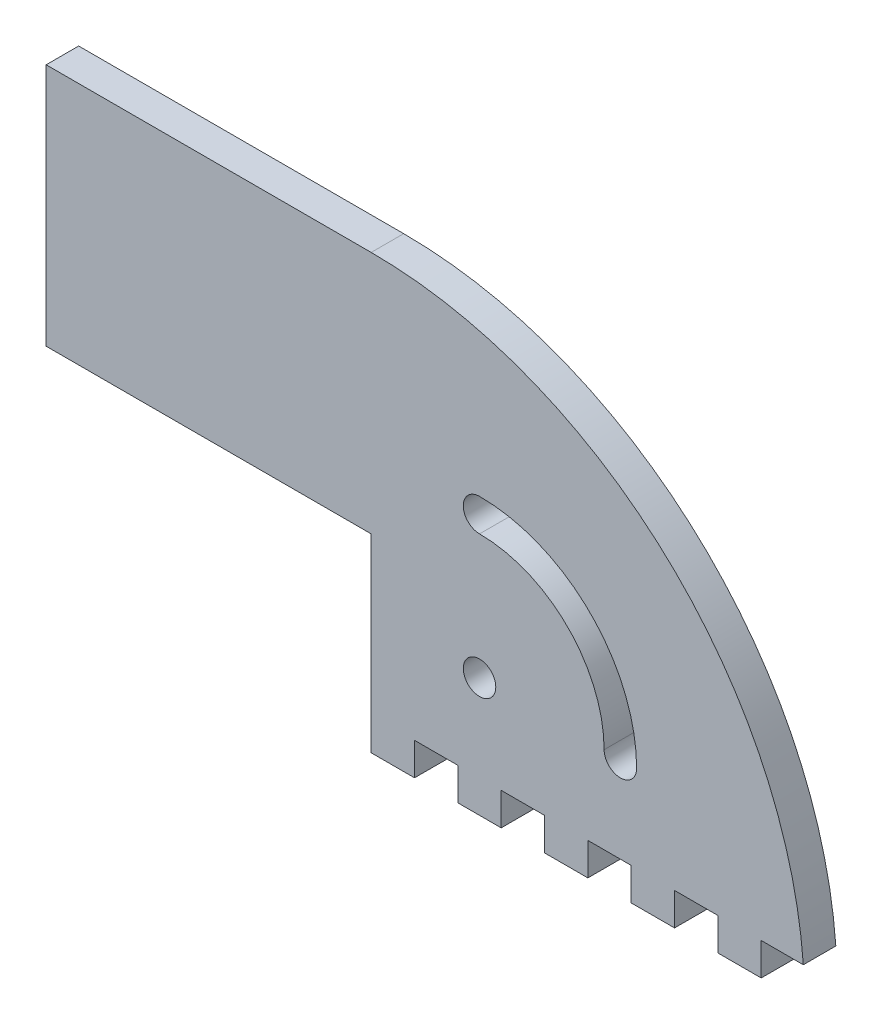
ISO-10303-21;
HEADER;
FILE_DESCRIPTION(('STEP AP214'),'2;1');
FILE_NAME('part.step','',(''),(''),'','','');
FILE_SCHEMA(('AUTOMOTIVE_DESIGN { 1 0 10303 214 1 1 1 1 }'));
ENDSEC;
DATA;
#1=APPLICATION_CONTEXT('core data for automotive mechanical design processes');
#2=APPLICATION_PROTOCOL_DEFINITION('international standard','automotive_design',2000,#1);
#3=PRODUCT_CONTEXT('',#1,'mechanical');
#4=PRODUCT('Part','Part','',(#3));
#5=PRODUCT_RELATED_PRODUCT_CATEGORY('part','',(#4));
#6=PRODUCT_DEFINITION_FORMATION('','',#4);
#7=PRODUCT_DEFINITION_CONTEXT('part definition',#1,'design');
#8=PRODUCT_DEFINITION('design','',#6,#7);
#9=PRODUCT_DEFINITION_SHAPE('','',#8);
#10=(LENGTH_UNIT() NAMED_UNIT(*) SI_UNIT(.MILLI.,.METRE.));
#11=(NAMED_UNIT(*) PLANE_ANGLE_UNIT() SI_UNIT($,.RADIAN.));
#12=(NAMED_UNIT(*) SI_UNIT($,.STERADIAN.) SOLID_ANGLE_UNIT());
#13=UNCERTAINTY_MEASURE_WITH_UNIT(LENGTH_MEASURE(1.E-05),#10,'distance_accuracy_value','');
#14=(GEOMETRIC_REPRESENTATION_CONTEXT(3) GLOBAL_UNCERTAINTY_ASSIGNED_CONTEXT((#13)) GLOBAL_UNIT_ASSIGNED_CONTEXT((#10,
#11,#12)) REPRESENTATION_CONTEXT('',''));
#15=CARTESIAN_POINT('',(0.,0.,0.));
#16=DIRECTION('',(0.,0.,1.));
#17=DIRECTION('',(1.,0.,0.));
#18=AXIS2_PLACEMENT_3D('',#15,#16,#17);
#19=CARTESIAN_POINT('',(0.,0.,3.));
#20=DIRECTION('',(0.,1.,0.));
#21=DIRECTION('',(0.,0.,1.));
#22=AXIS2_PLACEMENT_3D('',#19,#20,#21);
#23=PLANE('',#22);
#24=DIRECTION('',(1.,0.,0.));
#25=VECTOR('',#24,1.);
#26=CARTESIAN_POINT('',(0.,0.,0.));
#27=LINE('',#26,#25);
#28=CARTESIAN_POINT('',(24.,0.,0.));
#29=VERTEX_POINT('',#28);
#30=CARTESIAN_POINT('',(28.,0.,0.));
#31=VERTEX_POINT('',#30);
#32=EDGE_CURVE('E239',#29,#31,#27,.T.);
#33=ORIENTED_EDGE('',*,*,#32,.T.);
#34=DIRECTION('',(0.,0.,1.));
#35=VECTOR('',#34,1.);
#36=CARTESIAN_POINT('',(28.,0.,0.));
#37=LINE('',#36,#35);
#38=CARTESIAN_POINT('',(28.,0.,3.));
#39=VERTEX_POINT('',#38);
#40=EDGE_CURVE('E291',#31,#39,#37,.T.);
#41=ORIENTED_EDGE('',*,*,#40,.T.);
#42=DIRECTION('',(1.,0.,0.));
#43=VECTOR('',#42,1.);
#44=CARTESIAN_POINT('',(0.,0.,3.));
#45=LINE('',#44,#43);
#46=CARTESIAN_POINT('',(24.,0.,3.));
#47=VERTEX_POINT('',#46);
#48=EDGE_CURVE('E483',#47,#39,#45,.T.);
#49=ORIENTED_EDGE('',*,*,#48,.F.);
#50=DIRECTION('',(0.,0.,1.));
#51=VECTOR('',#50,1.);
#52=CARTESIAN_POINT('',(24.,0.,0.));
#53=LINE('',#52,#51);
#54=EDGE_CURVE('E305',#29,#47,#53,.T.);
#55=ORIENTED_EDGE('',*,*,#54,.F.);
#56=EDGE_LOOP('',(#33,#41,#49,#55));
#57=FACE_BOUND('',#56,.T.);
#58=ADVANCED_FACE('F33',(#57),#23,.F.);
#59=CARTESIAN_POINT('',(16.,0.,0.));
#60=VERTEX_POINT('',#59);
#61=CARTESIAN_POINT('',(20.,0.,0.));
#62=VERTEX_POINT('',#61);
#63=EDGE_CURVE('E244',#60,#62,#27,.T.);
#64=ORIENTED_EDGE('',*,*,#63,.T.);
#65=DIRECTION('',(0.,0.,1.));
#66=VECTOR('',#65,1.);
#67=CARTESIAN_POINT('',(20.,0.,0.));
#68=LINE('',#67,#66);
#69=CARTESIAN_POINT('',(20.,0.,3.));
#70=VERTEX_POINT('',#69);
#71=EDGE_CURVE('E269',#62,#70,#68,.T.);
#72=ORIENTED_EDGE('',*,*,#71,.T.);
#73=CARTESIAN_POINT('',(16.,0.,3.));
#74=VERTEX_POINT('',#73);
#75=EDGE_CURVE('E491',#74,#70,#45,.T.);
#76=ORIENTED_EDGE('',*,*,#75,.F.);
#77=DIRECTION('',(0.,0.,1.));
#78=VECTOR('',#77,1.);
#79=CARTESIAN_POINT('',(16.,0.,0.));
#80=LINE('',#79,#78);
#81=EDGE_CURVE('E271',#60,#74,#80,.T.);
#82=ORIENTED_EDGE('',*,*,#81,.F.);
#83=EDGE_LOOP('',(#64,#72,#76,#82));
#84=FACE_BOUND('',#83,.T.);
#85=ADVANCED_FACE('F267',(#84),#23,.F.);
#86=CARTESIAN_POINT('',(8.,0.,0.));
#87=VERTEX_POINT('',#86);
#88=CARTESIAN_POINT('',(12.,0.,0.));
#89=VERTEX_POINT('',#88);
#90=EDGE_CURVE('E250',#87,#89,#27,.T.);
#91=ORIENTED_EDGE('',*,*,#90,.T.);
#92=DIRECTION('',(0.,0.,1.));
#93=VECTOR('',#92,1.);
#94=CARTESIAN_POINT('',(12.,0.,0.));
#95=LINE('',#94,#93);
#96=CARTESIAN_POINT('',(12.,0.,3.));
#97=VERTEX_POINT('',#96);
#98=EDGE_CURVE('E315',#89,#97,#95,.T.);
#99=ORIENTED_EDGE('',*,*,#98,.T.);
#100=CARTESIAN_POINT('',(8.,0.,3.));
#101=VERTEX_POINT('',#100);
#102=EDGE_CURVE('E403',#101,#97,#45,.T.);
#103=ORIENTED_EDGE('',*,*,#102,.F.);
#104=DIRECTION('',(0.,0.,1.));
#105=VECTOR('',#104,1.);
#106=CARTESIAN_POINT('',(8.,0.,0.));
#107=LINE('',#106,#105);
#108=EDGE_CURVE('E351',#87,#101,#107,.T.);
#109=ORIENTED_EDGE('',*,*,#108,.F.);
#110=EDGE_LOOP('',(#91,#99,#103,#109));
#111=FACE_BOUND('',#110,.T.);
#112=ADVANCED_FACE('F515',(#111),#23,.F.);
#113=CARTESIAN_POINT('',(0.,0.,0.));
#114=VERTEX_POINT('',#113);
#115=CARTESIAN_POINT('',(4.,0.,0.));
#116=VERTEX_POINT('',#115);
#117=EDGE_CURVE('E242',#114,#116,#27,.T.);
#118=ORIENTED_EDGE('',*,*,#117,.T.);
#119=DIRECTION('',(0.,0.,1.));
#120=VECTOR('',#119,1.);
#121=CARTESIAN_POINT('',(4.,0.,0.));
#122=LINE('',#121,#120);
#123=CARTESIAN_POINT('',(4.,0.,3.));
#124=VERTEX_POINT('',#123);
#125=EDGE_CURVE('E339',#116,#124,#122,.T.);
#126=ORIENTED_EDGE('',*,*,#125,.T.);
#127=CARTESIAN_POINT('',(0.,0.,3.));
#128=VERTEX_POINT('',#127);
#129=EDGE_CURVE('E399',#128,#124,#45,.T.);
#130=ORIENTED_EDGE('',*,*,#129,.F.);
#131=DIRECTION('',(0.,0.,-1.));
#132=VECTOR('',#131,1.);
#133=CARTESIAN_POINT('',(0.,0.,3.));
#134=LINE('',#133,#132);
#135=EDGE_CURVE('E402',#128,#114,#134,.T.);
#136=ORIENTED_EDGE('',*,*,#135,.T.);
#137=EDGE_LOOP('',(#118,#126,#130,#136));
#138=FACE_BOUND('',#137,.T.);
#139=ADVANCED_FACE('F432',(#138),#23,.F.);
#140=CARTESIAN_POINT('',(-1.04083408558608E-13,-1.04083408558608E-13,3.));
#141=DIRECTION('',(0.,0.,-1.));
#142=DIRECTION('',(-1.,0.,0.));
#143=AXIS2_PLACEMENT_3D('',#140,#141,#142);
#144=PLANE('',#143);
#145=CARTESIAN_POINT('',(10.,11.,3.));
#146=DIRECTION('',(0.,0.,1.));
#147=DIRECTION('',(1.,0.,0.));
#148=AXIS2_PLACEMENT_3D('',#145,#146,#147);
#149=CIRCLE('',#148,1.5);
#150=CARTESIAN_POINT('',(11.5,11.,3.));
#151=VERTEX_POINT('',#150);
#152=EDGE_CURVE('E385',#151,#151,#149,.T.);
#153=ORIENTED_EDGE('',*,*,#152,.F.);
#154=EDGE_LOOP('',(#153));
#155=FACE_BOUND('',#154,.T.);
#156=CARTESIAN_POINT('',(32.,0.,3.));
#157=VERTEX_POINT('',#156);
#158=CARTESIAN_POINT('',(36.,0.,3.));
#159=VERTEX_POINT('',#158);
#160=EDGE_CURVE('E398',#157,#159,#45,.T.);
#161=ORIENTED_EDGE('',*,*,#160,.T.);
#162=DIRECTION('',(0.,-1.,0.));
#163=VECTOR('',#162,1.);
#164=CARTESIAN_POINT('',(36.,0.,3.));
#165=LINE('',#164,#163);
#166=CARTESIAN_POINT('',(36.,3.,3.));
#167=VERTEX_POINT('',#166);
#168=EDGE_CURVE('E48',#167,#159,#165,.T.);
#169=ORIENTED_EDGE('',*,*,#168,.F.);
#170=DIRECTION('',(-1.,0.,0.));
#171=VECTOR('',#170,1.);
#172=CARTESIAN_POINT('',(36.,3.,3.));
#173=LINE('',#172,#171);
#174=CARTESIAN_POINT('',(39.8873413503583,3.,3.));
#175=VERTEX_POINT('',#174);
#176=EDGE_CURVE('E235',#175,#167,#173,.T.);
#177=ORIENTED_EDGE('',*,*,#176,.F.);
#178=CARTESIAN_POINT('',(-1.04083408558608E-13,-1.04083408558608E-13,3.));
#179=DIRECTION('',(0.,0.,1.));
#180=DIRECTION('',(-1.,0.,0.));
#181=AXIS2_PLACEMENT_3D('',#178,#179,#180);
#182=CIRCLE('',#181,40.0000000000001);
#183=CARTESIAN_POINT('',(0.,40.,3.));
#184=VERTEX_POINT('',#183);
#185=EDGE_CURVE('E249',#175,#184,#182,.T.);
#186=ORIENTED_EDGE('',*,*,#185,.T.);
#187=DIRECTION('',(-1.,0.,0.));
#188=VECTOR('',#187,1.);
#189=CARTESIAN_POINT('',(0.,40.,3.));
#190=LINE('',#189,#188);
#191=CARTESIAN_POINT('',(-30.,40.,3.));
#192=VERTEX_POINT('',#191);
#193=EDGE_CURVE('E255',#184,#192,#190,.T.);
#194=ORIENTED_EDGE('',*,*,#193,.T.);
#195=DIRECTION('',(0.,-1.,0.));
#196=VECTOR('',#195,1.);
#197=CARTESIAN_POINT('',(-30.,40.,3.));
#198=LINE('',#197,#196);
#199=CARTESIAN_POINT('',(-30.,17.5,3.));
#200=VERTEX_POINT('',#199);
#201=EDGE_CURVE('E392',#192,#200,#198,.T.);
#202=ORIENTED_EDGE('',*,*,#201,.T.);
#203=DIRECTION('',(1.,0.,0.));
#204=VECTOR('',#203,1.);
#205=CARTESIAN_POINT('',(0.,17.5,3.));
#206=LINE('',#205,#204);
#207=CARTESIAN_POINT('',(0.,17.5,3.));
#208=VERTEX_POINT('',#207);
#209=EDGE_CURVE('E394',#200,#208,#206,.T.);
#210=ORIENTED_EDGE('',*,*,#209,.T.);
#211=DIRECTION('',(0.,-1.,0.));
#212=VECTOR('',#211,1.);
#213=CARTESIAN_POINT('',(0.,17.5,3.));
#214=LINE('',#213,#212);
#215=EDGE_CURVE('E396',#208,#128,#214,.T.);
#216=ORIENTED_EDGE('',*,*,#215,.T.);
#217=ORIENTED_EDGE('',*,*,#129,.T.);
#218=DIRECTION('',(0.,-1.,0.));
#219=VECTOR('',#218,1.);
#220=CARTESIAN_POINT('',(4.,0.,3.));
#221=LINE('',#220,#219);
#222=CARTESIAN_POINT('',(4.,3.,3.));
#223=VERTEX_POINT('',#222);
#224=EDGE_CURVE('E324',#223,#124,#221,.T.);
#225=ORIENTED_EDGE('',*,*,#224,.F.);
#226=DIRECTION('',(-1.,0.,0.));
#227=VECTOR('',#226,1.);
#228=CARTESIAN_POINT('',(4.,3.,3.));
#229=LINE('',#228,#227);
#230=CARTESIAN_POINT('',(8.,3.,3.));
#231=VERTEX_POINT('',#230);
#232=EDGE_CURVE('E333',#231,#223,#229,.T.);
#233=ORIENTED_EDGE('',*,*,#232,.F.);
#234=DIRECTION('',(0.,1.,0.));
#235=VECTOR('',#234,1.);
#236=CARTESIAN_POINT('',(8.,0.,3.));
#237=LINE('',#236,#235);
#238=EDGE_CURVE('E341',#101,#231,#237,.T.);
#239=ORIENTED_EDGE('',*,*,#238,.F.);
#240=ORIENTED_EDGE('',*,*,#102,.T.);
#241=DIRECTION('',(0.,-1.,0.));
#242=VECTOR('',#241,1.);
#243=CARTESIAN_POINT('',(12.,0.,3.));
#244=LINE('',#243,#242);
#245=CARTESIAN_POINT('',(12.,3.,3.));
#246=VERTEX_POINT('',#245);
#247=EDGE_CURVE('E302',#246,#97,#244,.T.);
#248=ORIENTED_EDGE('',*,*,#247,.F.);
#249=DIRECTION('',(-1.,0.,0.));
#250=VECTOR('',#249,1.);
#251=CARTESIAN_POINT('',(12.,3.,3.));
#252=LINE('',#251,#250);
#253=CARTESIAN_POINT('',(16.,3.,3.));
#254=VERTEX_POINT('',#253);
#255=EDGE_CURVE('E311',#254,#246,#252,.T.);
#256=ORIENTED_EDGE('',*,*,#255,.F.);
#257=DIRECTION('',(0.,1.,0.));
#258=VECTOR('',#257,1.);
#259=CARTESIAN_POINT('',(16.,0.,3.));
#260=LINE('',#259,#258);
#261=EDGE_CURVE('E317',#74,#254,#260,.T.);
#262=ORIENTED_EDGE('',*,*,#261,.F.);
#263=ORIENTED_EDGE('',*,*,#75,.T.);
#264=DIRECTION('',(0.,-1.,0.));
#265=VECTOR('',#264,1.);
#266=CARTESIAN_POINT('',(20.,0.,3.));
#267=LINE('',#266,#265);
#268=CARTESIAN_POINT('',(20.,3.,3.));
#269=VERTEX_POINT('',#268);
#270=EDGE_CURVE('E295',#269,#70,#267,.T.);
#271=ORIENTED_EDGE('',*,*,#270,.F.);
#272=DIRECTION('',(-1.,0.,0.));
#273=VECTOR('',#272,1.);
#274=CARTESIAN_POINT('',(20.,3.,3.));
#275=LINE('',#274,#273);
#276=CARTESIAN_POINT('',(24.,3.,3.));
#277=VERTEX_POINT('',#276);
#278=EDGE_CURVE('E284',#277,#269,#275,.T.);
#279=ORIENTED_EDGE('',*,*,#278,.F.);
#280=DIRECTION('',(0.,1.,0.));
#281=VECTOR('',#280,1.);
#282=CARTESIAN_POINT('',(24.,0.,3.));
#283=LINE('',#282,#281);
#284=EDGE_CURVE('E288',#47,#277,#283,.T.);
#285=ORIENTED_EDGE('',*,*,#284,.F.);
#286=ORIENTED_EDGE('',*,*,#48,.T.);
#287=DIRECTION('',(0.,-1.,0.));
#288=VECTOR('',#287,1.);
#289=CARTESIAN_POINT('',(28.,0.,3.));
#290=LINE('',#289,#288);
#291=CARTESIAN_POINT('',(28.,3.,3.));
#292=VERTEX_POINT('',#291);
#293=EDGE_CURVE('E459',#292,#39,#290,.T.);
#294=ORIENTED_EDGE('',*,*,#293,.F.);
#295=DIRECTION('',(-1.,0.,0.));
#296=VECTOR('',#295,1.);
#297=CARTESIAN_POINT('',(28.,3.,3.));
#298=LINE('',#297,#296);
#299=CARTESIAN_POINT('',(32.,3.,3.));
#300=VERTEX_POINT('',#299);
#301=EDGE_CURVE('E464',#300,#292,#298,.T.);
#302=ORIENTED_EDGE('',*,*,#301,.F.);
#303=DIRECTION('',(0.,1.,0.));
#304=VECTOR('',#303,1.);
#305=CARTESIAN_POINT('',(32.,0.,3.));
#306=LINE('',#305,#304);
#307=EDGE_CURVE('E470',#157,#300,#306,.T.);
#308=ORIENTED_EDGE('',*,*,#307,.F.);
#309=EDGE_LOOP('',(#161,#169,#177,#186,#194,#202,#210,#216,#217,#225,#233,#239,#240,#248,#256,
#262,#263,#271,#279,#285,#286,#294,#302,#308));
#310=FACE_BOUND('',#309,.T.);
#311=CARTESIAN_POINT('',(10.,11.,3.));
#312=DIRECTION('',(0.,0.,-1.));
#313=DIRECTION('',(1.,0.,0.));
#314=AXIS2_PLACEMENT_3D('',#311,#312,#313);
#315=CIRCLE('',#314,11.5);
#316=CARTESIAN_POINT('',(10.,22.5,3.));
#317=VERTEX_POINT('',#316);
#318=CARTESIAN_POINT('',(21.5,11.,3.));
#319=VERTEX_POINT('',#318);
#320=EDGE_CURVE('E354',#317,#319,#315,.T.);
#321=ORIENTED_EDGE('',*,*,#320,.F.);
#322=CARTESIAN_POINT('',(10.,24.,3.));
#323=DIRECTION('',(0.,0.,1.));
#324=DIRECTION('',(-1.,0.,0.));
#325=AXIS2_PLACEMENT_3D('',#322,#323,#324);
#326=CIRCLE('',#325,1.5);
#327=CARTESIAN_POINT('',(10.,25.5,3.));
#328=VERTEX_POINT('',#327);
#329=EDGE_CURVE('E362',#328,#317,#326,.T.);
#330=ORIENTED_EDGE('',*,*,#329,.F.);
#331=CARTESIAN_POINT('',(10.,11.,3.));
#332=DIRECTION('',(0.,0.,1.));
#333=DIRECTION('',(1.,0.,0.));
#334=AXIS2_PLACEMENT_3D('',#331,#332,#333);
#335=CIRCLE('',#334,14.5);
#336=CARTESIAN_POINT('',(24.5,11.,3.));
#337=VERTEX_POINT('',#336);
#338=EDGE_CURVE('E359',#337,#328,#335,.T.);
#339=ORIENTED_EDGE('',*,*,#338,.F.);
#340=CARTESIAN_POINT('',(23.,11.,3.));
#341=DIRECTION('',(0.,0.,1.));
#342=DIRECTION('',(1.,0.,0.));
#343=AXIS2_PLACEMENT_3D('',#340,#341,#342);
#344=CIRCLE('',#343,1.5);
#345=EDGE_CURVE('E356',#319,#337,#344,.T.);
#346=ORIENTED_EDGE('',*,*,#345,.F.);
#347=EDGE_LOOP('',(#321,#330,#339,#346));
#348=FACE_BOUND('',#347,.T.);
#349=ADVANCED_FACE('F434',(#155,#310,#348),#144,.F.);
#350=CARTESIAN_POINT('',(-1.04083408558608E-13,-1.04083408558608E-13,0.));
#351=DIRECTION('',(0.,0.,-1.));
#352=DIRECTION('',(-1.,0.,0.));
#353=AXIS2_PLACEMENT_3D('',#350,#351,#352);
#354=PLANE('',#353);
#355=DIRECTION('',(0.,-1.,0.));
#356=VECTOR('',#355,1.);
#357=CARTESIAN_POINT('',(36.,0.,0.));
#358=LINE('',#357,#356);
#359=CARTESIAN_POINT('',(36.,3.,0.));
#360=VERTEX_POINT('',#359);
#361=CARTESIAN_POINT('',(36.,0.,0.));
#362=VERTEX_POINT('',#361);
#363=EDGE_CURVE('E220',#360,#362,#358,.T.);
#364=ORIENTED_EDGE('',*,*,#363,.T.);
#365=CARTESIAN_POINT('',(32.,0.,0.));
#366=VERTEX_POINT('',#365);
#367=EDGE_CURVE('E233',#366,#362,#27,.T.);
#368=ORIENTED_EDGE('',*,*,#367,.F.);
#369=DIRECTION('',(0.,1.,0.));
#370=VECTOR('',#369,1.);
#371=CARTESIAN_POINT('',(32.,0.,0.));
#372=LINE('',#371,#370);
#373=CARTESIAN_POINT('',(32.,3.,0.));
#374=VERTEX_POINT('',#373);
#375=EDGE_CURVE('E56',#366,#374,#372,.T.);
#376=ORIENTED_EDGE('',*,*,#375,.T.);
#377=DIRECTION('',(-1.,0.,0.));
#378=VECTOR('',#377,1.);
#379=CARTESIAN_POINT('',(28.,3.,0.));
#380=LINE('',#379,#378);
#381=CARTESIAN_POINT('',(28.,3.,0.));
#382=VERTEX_POINT('',#381);
#383=EDGE_CURVE('E466',#374,#382,#380,.T.);
#384=ORIENTED_EDGE('',*,*,#383,.T.);
#385=DIRECTION('',(0.,-1.,0.));
#386=VECTOR('',#385,1.);
#387=CARTESIAN_POINT('',(28.,0.,0.));
#388=LINE('',#387,#386);
#389=EDGE_CURVE('E461',#382,#31,#388,.T.);
#390=ORIENTED_EDGE('',*,*,#389,.T.);
#391=ORIENTED_EDGE('',*,*,#32,.F.);
#392=DIRECTION('',(0.,1.,0.));
#393=VECTOR('',#392,1.);
#394=CARTESIAN_POINT('',(24.,0.,0.));
#395=LINE('',#394,#393);
#396=CARTESIAN_POINT('',(24.,3.,0.));
#397=VERTEX_POINT('',#396);
#398=EDGE_CURVE('E283',#29,#397,#395,.T.);
#399=ORIENTED_EDGE('',*,*,#398,.T.);
#400=DIRECTION('',(-1.,0.,0.));
#401=VECTOR('',#400,1.);
#402=CARTESIAN_POINT('',(20.,3.,0.));
#403=LINE('',#402,#401);
#404=CARTESIAN_POINT('',(20.,3.,0.));
#405=VERTEX_POINT('',#404);
#406=EDGE_CURVE('E281',#397,#405,#403,.T.);
#407=ORIENTED_EDGE('',*,*,#406,.T.);
#408=DIRECTION('',(0.,-1.,0.));
#409=VECTOR('',#408,1.);
#410=CARTESIAN_POINT('',(20.,0.,0.));
#411=LINE('',#410,#409);
#412=EDGE_CURVE('E278',#405,#62,#411,.T.);
#413=ORIENTED_EDGE('',*,*,#412,.T.);
#414=ORIENTED_EDGE('',*,*,#63,.F.);
#415=DIRECTION('',(0.,1.,0.));
#416=VECTOR('',#415,1.);
#417=CARTESIAN_POINT('',(16.,0.,0.));
#418=LINE('',#417,#416);
#419=CARTESIAN_POINT('',(16.,3.,0.));
#420=VERTEX_POINT('',#419);
#421=EDGE_CURVE('E275',#60,#420,#418,.T.);
#422=ORIENTED_EDGE('',*,*,#421,.T.);
#423=DIRECTION('',(-1.,0.,0.));
#424=VECTOR('',#423,1.);
#425=CARTESIAN_POINT('',(12.,3.,0.));
#426=LINE('',#425,#424);
#427=CARTESIAN_POINT('',(12.,3.,0.));
#428=VERTEX_POINT('',#427);
#429=EDGE_CURVE('E313',#420,#428,#426,.T.);
#430=ORIENTED_EDGE('',*,*,#429,.T.);
#431=DIRECTION('',(0.,-1.,0.));
#432=VECTOR('',#431,1.);
#433=CARTESIAN_POINT('',(12.,0.,0.));
#434=LINE('',#433,#432);
#435=EDGE_CURVE('E308',#428,#89,#434,.T.);
#436=ORIENTED_EDGE('',*,*,#435,.T.);
#437=ORIENTED_EDGE('',*,*,#90,.F.);
#438=DIRECTION('',(0.,1.,0.));
#439=VECTOR('',#438,1.);
#440=CARTESIAN_POINT('',(8.,0.,0.));
#441=LINE('',#440,#439);
#442=CARTESIAN_POINT('',(8.,3.,0.));
#443=VERTEX_POINT('',#442);
#444=EDGE_CURVE('E332',#87,#443,#441,.T.);
#445=ORIENTED_EDGE('',*,*,#444,.T.);
#446=DIRECTION('',(-1.,0.,0.));
#447=VECTOR('',#446,1.);
#448=CARTESIAN_POINT('',(4.,3.,0.));
#449=LINE('',#448,#447);
#450=CARTESIAN_POINT('',(4.,3.,0.));
#451=VERTEX_POINT('',#450);
#452=EDGE_CURVE('E336',#443,#451,#449,.T.);
#453=ORIENTED_EDGE('',*,*,#452,.T.);
#454=DIRECTION('',(0.,-1.,0.));
#455=VECTOR('',#454,1.);
#456=CARTESIAN_POINT('',(4.,0.,0.));
#457=LINE('',#456,#455);
#458=EDGE_CURVE('E329',#451,#116,#457,.T.);
#459=ORIENTED_EDGE('',*,*,#458,.T.);
#460=ORIENTED_EDGE('',*,*,#117,.F.);
#461=DIRECTION('',(0.,-1.,0.));
#462=VECTOR('',#461,1.);
#463=CARTESIAN_POINT('',(0.,17.5,0.));
#464=LINE('',#463,#462);
#465=CARTESIAN_POINT('',(0.,17.5,0.));
#466=VERTEX_POINT('',#465);
#467=EDGE_CURVE('E240',#466,#114,#464,.T.);
#468=ORIENTED_EDGE('',*,*,#467,.F.);
#469=DIRECTION('',(1.,0.,0.));
#470=VECTOR('',#469,1.);
#471=CARTESIAN_POINT('',(0.,17.5,0.));
#472=LINE('',#471,#470);
#473=CARTESIAN_POINT('',(-30.,17.5,0.));
#474=VERTEX_POINT('',#473);
#475=EDGE_CURVE('E245',#474,#466,#472,.T.);
#476=ORIENTED_EDGE('',*,*,#475,.F.);
#477=DIRECTION('',(0.,-1.,0.));
#478=VECTOR('',#477,1.);
#479=CARTESIAN_POINT('',(-30.,40.,0.));
#480=LINE('',#479,#478);
#481=CARTESIAN_POINT('',(-30.,40.,0.));
#482=VERTEX_POINT('',#481);
#483=EDGE_CURVE('E407',#482,#474,#480,.T.);
#484=ORIENTED_EDGE('',*,*,#483,.F.);
#485=DIRECTION('',(-1.,0.,0.));
#486=VECTOR('',#485,1.);
#487=CARTESIAN_POINT('',(0.,40.,0.));
#488=LINE('',#487,#486);
#489=CARTESIAN_POINT('',(0.,40.,0.));
#490=VERTEX_POINT('',#489);
#491=EDGE_CURVE('E405',#490,#482,#488,.T.);
#492=ORIENTED_EDGE('',*,*,#491,.F.);
#493=CARTESIAN_POINT('',(-1.04083408558608E-13,-1.04083408558608E-13,0.));
#494=DIRECTION('',(0.,0.,1.));
#495=DIRECTION('',(-1.,0.,0.));
#496=AXIS2_PLACEMENT_3D('',#493,#494,#495);
#497=CIRCLE('',#496,40.0000000000001);
#498=CARTESIAN_POINT('',(39.8873413503583,3.,0.));
#499=VERTEX_POINT('',#498);
#500=EDGE_CURVE('E388',#499,#490,#497,.T.);
#501=ORIENTED_EDGE('',*,*,#500,.F.);
#502=DIRECTION('',(-1.,0.,0.));
#503=VECTOR('',#502,1.);
#504=CARTESIAN_POINT('',(36.,3.,0.));
#505=LINE('',#504,#503);
#506=EDGE_CURVE('E227',#499,#360,#505,.T.);
#507=ORIENTED_EDGE('',*,*,#506,.T.);
#508=EDGE_LOOP('',(#364,#368,#376,#384,#390,#391,#399,#407,#413,#414,#422,#430,#436,#437,#445,
#453,#459,#460,#468,#476,#484,#492,#501,#507));
#509=FACE_BOUND('',#508,.T.);
#510=CARTESIAN_POINT('',(10.,11.,0.));
#511=DIRECTION('',(0.,0.,1.));
#512=DIRECTION('',(1.,0.,0.));
#513=AXIS2_PLACEMENT_3D('',#510,#511,#512);
#514=CIRCLE('',#513,1.5);
#515=CARTESIAN_POINT('',(11.5,11.,0.));
#516=VERTEX_POINT('',#515);
#517=EDGE_CURVE('E384',#516,#516,#514,.T.);
#518=ORIENTED_EDGE('',*,*,#517,.T.);
#519=EDGE_LOOP('',(#518));
#520=FACE_BOUND('',#519,.T.);
#521=CARTESIAN_POINT('',(10.,24.,0.));
#522=DIRECTION('',(0.,0.,1.));
#523=DIRECTION('',(-1.,0.,0.));
#524=AXIS2_PLACEMENT_3D('',#521,#522,#523);
#525=CIRCLE('',#524,1.5);
#526=CARTESIAN_POINT('',(10.,25.5,0.));
#527=VERTEX_POINT('',#526);
#528=CARTESIAN_POINT('',(10.,22.5,0.));
#529=VERTEX_POINT('',#528);
#530=EDGE_CURVE('E357',#527,#529,#525,.T.);
#531=ORIENTED_EDGE('',*,*,#530,.T.);
#532=CARTESIAN_POINT('',(10.,11.,0.));
#533=DIRECTION('',(0.,0.,-1.));
#534=DIRECTION('',(1.,0.,0.));
#535=AXIS2_PLACEMENT_3D('',#532,#533,#534);
#536=CIRCLE('',#535,11.5);
#537=CARTESIAN_POINT('',(21.5,11.,0.));
#538=VERTEX_POINT('',#537);
#539=EDGE_CURVE('E348',#529,#538,#536,.T.);
#540=ORIENTED_EDGE('',*,*,#539,.T.);
#541=CARTESIAN_POINT('',(23.,11.,0.));
#542=DIRECTION('',(0.,0.,1.));
#543=DIRECTION('',(1.,0.,0.));
#544=AXIS2_PLACEMENT_3D('',#541,#542,#543);
#545=CIRCLE('',#544,1.5);
#546=CARTESIAN_POINT('',(24.5,11.,0.));
#547=VERTEX_POINT('',#546);
#548=EDGE_CURVE('E367',#538,#547,#545,.T.);
#549=ORIENTED_EDGE('',*,*,#548,.T.);
#550=CARTESIAN_POINT('',(10.,11.,0.));
#551=DIRECTION('',(0.,0.,1.));
#552=DIRECTION('',(1.,0.,0.));
#553=AXIS2_PLACEMENT_3D('',#550,#551,#552);
#554=CIRCLE('',#553,14.5);
#555=EDGE_CURVE('E370',#547,#527,#554,.T.);
#556=ORIENTED_EDGE('',*,*,#555,.T.);
#557=EDGE_LOOP('',(#531,#540,#549,#556));
#558=FACE_BOUND('',#557,.T.);
#559=ADVANCED_FACE('F231',(#509,#520,#558),#354,.T.);
#560=CARTESIAN_POINT('',(-1.04083408558608E-13,-1.04083408558608E-13,3.));
#561=DIRECTION('',(0.,0.,-1.));
#562=DIRECTION('',(-1.,0.,0.));
#563=AXIS2_PLACEMENT_3D('',#560,#561,#562);
#564=CYLINDRICAL_SURFACE('',#563,40.0000000000001);
#565=ORIENTED_EDGE('',*,*,#185,.F.);
#566=DIRECTION('',(0.,0.,-1.));
#567=VECTOR('',#566,1.);
#568=CARTESIAN_POINT('',(39.8873413503583,3.,3.));
#569=LINE('',#568,#567);
#570=EDGE_CURVE('E11',#175,#499,#569,.T.);
#571=ORIENTED_EDGE('',*,*,#570,.T.);
#572=ORIENTED_EDGE('',*,*,#500,.T.);
#573=DIRECTION('',(0.,0.,-1.));
#574=VECTOR('',#573,1.);
#575=CARTESIAN_POINT('',(0.,40.,3.));
#576=LINE('',#575,#574);
#577=EDGE_CURVE('E41',#184,#490,#576,.T.);
#578=ORIENTED_EDGE('',*,*,#577,.F.);
#579=EDGE_LOOP('',(#565,#571,#572,#578));
#580=FACE_BOUND('',#579,.T.);
#581=ADVANCED_FACE('F35',(#580),#564,.T.);
#582=CARTESIAN_POINT('',(0.,40.,3.));
#583=DIRECTION('',(0.,-1.,0.));
#584=DIRECTION('',(1.,0.,0.));
#585=AXIS2_PLACEMENT_3D('',#582,#583,#584);
#586=PLANE('',#585);
#587=ORIENTED_EDGE('',*,*,#491,.T.);
#588=DIRECTION('',(0.,0.,-1.));
#589=VECTOR('',#588,1.);
#590=CARTESIAN_POINT('',(-30.,40.,3.));
#591=LINE('',#590,#589);
#592=EDGE_CURVE('E439',#192,#482,#591,.T.);
#593=ORIENTED_EDGE('',*,*,#592,.F.);
#594=ORIENTED_EDGE('',*,*,#193,.F.);
#595=ORIENTED_EDGE('',*,*,#577,.T.);
#596=EDGE_LOOP('',(#587,#593,#594,#595));
#597=FACE_BOUND('',#596,.T.);
#598=ADVANCED_FACE('F445',(#597),#586,.F.);
#599=CARTESIAN_POINT('',(-30.,40.,3.));
#600=DIRECTION('',(1.,0.,0.));
#601=DIRECTION('',(0.,1.,0.));
#602=AXIS2_PLACEMENT_3D('',#599,#600,#601);
#603=PLANE('',#602);
#604=ORIENTED_EDGE('',*,*,#483,.T.);
#605=DIRECTION('',(0.,0.,-1.));
#606=VECTOR('',#605,1.);
#607=CARTESIAN_POINT('',(-30.,17.5,3.));
#608=LINE('',#607,#606);
#609=EDGE_CURVE('E419',#200,#474,#608,.T.);
#610=ORIENTED_EDGE('',*,*,#609,.F.);
#611=ORIENTED_EDGE('',*,*,#201,.F.);
#612=ORIENTED_EDGE('',*,*,#592,.T.);
#613=EDGE_LOOP('',(#604,#610,#611,#612));
#614=FACE_BOUND('',#613,.T.);
#615=ADVANCED_FACE('F451',(#614),#603,.F.);
#616=CARTESIAN_POINT('',(0.,17.5,3.));
#617=DIRECTION('',(0.,1.,0.));
#618=DIRECTION('',(-1.,0.,0.));
#619=AXIS2_PLACEMENT_3D('',#616,#617,#618);
#620=PLANE('',#619);
#621=ORIENTED_EDGE('',*,*,#475,.T.);
#622=DIRECTION('',(0.,0.,-1.));
#623=VECTOR('',#622,1.);
#624=CARTESIAN_POINT('',(0.,17.5,3.));
#625=LINE('',#624,#623);
#626=EDGE_CURVE('E416',#208,#466,#625,.T.);
#627=ORIENTED_EDGE('',*,*,#626,.F.);
#628=ORIENTED_EDGE('',*,*,#209,.F.);
#629=ORIENTED_EDGE('',*,*,#609,.T.);
#630=EDGE_LOOP('',(#621,#627,#628,#629));
#631=FACE_BOUND('',#630,.T.);
#632=ADVANCED_FACE('F414',(#631),#620,.F.);
#633=CARTESIAN_POINT('',(0.,17.5,3.));
#634=DIRECTION('',(1.,0.,0.));
#635=DIRECTION('',(0.,1.,0.));
#636=AXIS2_PLACEMENT_3D('',#633,#634,#635);
#637=PLANE('',#636);
#638=ORIENTED_EDGE('',*,*,#467,.T.);
#639=ORIENTED_EDGE('',*,*,#135,.F.);
#640=ORIENTED_EDGE('',*,*,#215,.F.);
#641=ORIENTED_EDGE('',*,*,#626,.T.);
#642=EDGE_LOOP('',(#638,#639,#640,#641));
#643=FACE_BOUND('',#642,.T.);
#644=ADVANCED_FACE('F423',(#643),#637,.F.);
#645=ORIENTED_EDGE('',*,*,#367,.T.);
#646=DIRECTION('',(0.,0.,1.));
#647=VECTOR('',#646,1.);
#648=CARTESIAN_POINT('',(36.,0.,0.));
#649=LINE('',#648,#647);
#650=EDGE_CURVE('E217',#362,#159,#649,.T.);
#651=ORIENTED_EDGE('',*,*,#650,.T.);
#652=ORIENTED_EDGE('',*,*,#160,.F.);
#653=DIRECTION('',(0.,0.,1.));
#654=VECTOR('',#653,1.);
#655=CARTESIAN_POINT('',(32.,0.,0.));
#656=LINE('',#655,#654);
#657=EDGE_CURVE('E238',#366,#157,#656,.T.);
#658=ORIENTED_EDGE('',*,*,#657,.F.);
#659=EDGE_LOOP('',(#645,#651,#652,#658));
#660=FACE_BOUND('',#659,.T.);
#661=ADVANCED_FACE('F237',(#660),#23,.F.);
#662=CARTESIAN_POINT('',(10.,11.,3.));
#663=DIRECTION('',(0.,0.,-1.));
#664=DIRECTION('',(-1.,0.,0.));
#665=AXIS2_PLACEMENT_3D('',#662,#663,#664);
#666=CYLINDRICAL_SURFACE('',#665,1.5);
#667=ORIENTED_EDGE('',*,*,#152,.T.);
#668=EDGE_LOOP('',(#667));
#669=FACE_BOUND('',#668,.T.);
#670=ORIENTED_EDGE('',*,*,#517,.F.);
#671=EDGE_LOOP('',(#670));
#672=FACE_BOUND('',#671,.T.);
#673=ADVANCED_FACE('F519',(#669,#672),#666,.F.);
#674=CARTESIAN_POINT('',(10.,11.,3.));
#675=DIRECTION('',(0.,0.,-1.));
#676=DIRECTION('',(-1.,0.,0.));
#677=AXIS2_PLACEMENT_3D('',#674,#675,#676);
#678=CYLINDRICAL_SURFACE('',#677,11.5);
#679=ORIENTED_EDGE('',*,*,#539,.F.);
#680=DIRECTION('',(0.,0.,-1.));
#681=VECTOR('',#680,1.);
#682=CARTESIAN_POINT('',(10.,22.5,3.));
#683=LINE('',#682,#681);
#684=EDGE_CURVE('E364',#317,#529,#683,.T.);
#685=ORIENTED_EDGE('',*,*,#684,.F.);
#686=ORIENTED_EDGE('',*,*,#320,.T.);
#687=DIRECTION('',(0.,0.,-1.));
#688=VECTOR('',#687,1.);
#689=CARTESIAN_POINT('',(21.5,11.,3.));
#690=LINE('',#689,#688);
#691=EDGE_CURVE('E381',#319,#538,#690,.T.);
#692=ORIENTED_EDGE('',*,*,#691,.T.);
#693=EDGE_LOOP('',(#679,#685,#686,#692));
#694=FACE_BOUND('',#693,.T.);
#695=ADVANCED_FACE('F524',(#694),#678,.T.);
#696=CARTESIAN_POINT('',(23.,11.,3.));
#697=DIRECTION('',(0.,0.,-1.));
#698=DIRECTION('',(-1.,0.,0.));
#699=AXIS2_PLACEMENT_3D('',#696,#697,#698);
#700=CYLINDRICAL_SURFACE('',#699,1.5);
#701=ORIENTED_EDGE('',*,*,#548,.F.);
#702=ORIENTED_EDGE('',*,*,#691,.F.);
#703=ORIENTED_EDGE('',*,*,#345,.T.);
#704=DIRECTION('',(0.,0.,-1.));
#705=VECTOR('',#704,1.);
#706=CARTESIAN_POINT('',(24.5,11.,3.));
#707=LINE('',#706,#705);
#708=EDGE_CURVE('E379',#337,#547,#707,.T.);
#709=ORIENTED_EDGE('',*,*,#708,.T.);
#710=EDGE_LOOP('',(#701,#702,#703,#709));
#711=FACE_BOUND('',#710,.T.);
#712=ADVANCED_FACE('F600',(#711),#700,.F.);
#713=CARTESIAN_POINT('',(10.,11.,3.));
#714=DIRECTION('',(0.,0.,-1.));
#715=DIRECTION('',(-1.,0.,0.));
#716=AXIS2_PLACEMENT_3D('',#713,#714,#715);
#717=CYLINDRICAL_SURFACE('',#716,14.5);
#718=ORIENTED_EDGE('',*,*,#555,.F.);
#719=ORIENTED_EDGE('',*,*,#708,.F.);
#720=ORIENTED_EDGE('',*,*,#338,.T.);
#721=DIRECTION('',(0.,0.,-1.));
#722=VECTOR('',#721,1.);
#723=CARTESIAN_POINT('',(10.,25.5,3.));
#724=LINE('',#723,#722);
#725=EDGE_CURVE('E377',#328,#527,#724,.T.);
#726=ORIENTED_EDGE('',*,*,#725,.T.);
#727=EDGE_LOOP('',(#718,#719,#720,#726));
#728=FACE_BOUND('',#727,.T.);
#729=ADVANCED_FACE('F590',(#728),#717,.F.);
#730=CARTESIAN_POINT('',(10.,24.,3.));
#731=DIRECTION('',(0.,0.,-1.));
#732=DIRECTION('',(-1.,0.,0.));
#733=AXIS2_PLACEMENT_3D('',#730,#731,#732);
#734=CYLINDRICAL_SURFACE('',#733,1.5);
#735=ORIENTED_EDGE('',*,*,#530,.F.);
#736=ORIENTED_EDGE('',*,*,#725,.F.);
#737=ORIENTED_EDGE('',*,*,#329,.T.);
#738=ORIENTED_EDGE('',*,*,#684,.T.);
#739=EDGE_LOOP('',(#735,#736,#737,#738));
#740=FACE_BOUND('',#739,.T.);
#741=ADVANCED_FACE('F576',(#740),#734,.F.);
#742=CARTESIAN_POINT('',(4.,0.,0.));
#743=DIRECTION('',(-1.,0.,0.));
#744=DIRECTION('',(0.,0.,1.));
#745=AXIS2_PLACEMENT_3D('',#742,#743,#744);
#746=PLANE('',#745);
#747=ORIENTED_EDGE('',*,*,#224,.T.);
#748=ORIENTED_EDGE('',*,*,#125,.F.);
#749=ORIENTED_EDGE('',*,*,#458,.F.);
#750=DIRECTION('',(0.,0.,1.));
#751=VECTOR('',#750,1.);
#752=CARTESIAN_POINT('',(4.,3.,0.));
#753=LINE('',#752,#751);
#754=EDGE_CURVE('E346',#451,#223,#753,.T.);
#755=ORIENTED_EDGE('',*,*,#754,.T.);
#756=EDGE_LOOP('',(#747,#748,#749,#755));
#757=FACE_BOUND('',#756,.T.);
#758=ADVANCED_FACE('F429',(#757),#746,.F.);
#759=CARTESIAN_POINT('',(4.,3.,0.));
#760=DIRECTION('',(0.,1.,0.));
#761=DIRECTION('',(0.,0.,1.));
#762=AXIS2_PLACEMENT_3D('',#759,#760,#761);
#763=PLANE('',#762);
#764=ORIENTED_EDGE('',*,*,#232,.T.);
#765=ORIENTED_EDGE('',*,*,#754,.F.);
#766=ORIENTED_EDGE('',*,*,#452,.F.);
#767=DIRECTION('',(0.,0.,1.));
#768=VECTOR('',#767,1.);
#769=CARTESIAN_POINT('',(8.,3.,0.));
#770=LINE('',#769,#768);
#771=EDGE_CURVE('E349',#443,#231,#770,.T.);
#772=ORIENTED_EDGE('',*,*,#771,.T.);
#773=EDGE_LOOP('',(#764,#765,#766,#772));
#774=FACE_BOUND('',#773,.T.);
#775=ADVANCED_FACE('F557',(#774),#763,.F.);
#776=CARTESIAN_POINT('',(8.,0.,0.));
#777=DIRECTION('',(1.,0.,0.));
#778=DIRECTION('',(0.,0.,-1.));
#779=AXIS2_PLACEMENT_3D('',#776,#777,#778);
#780=PLANE('',#779);
#781=ORIENTED_EDGE('',*,*,#238,.T.);
#782=ORIENTED_EDGE('',*,*,#771,.F.);
#783=ORIENTED_EDGE('',*,*,#444,.F.);
#784=ORIENTED_EDGE('',*,*,#108,.T.);
#785=EDGE_LOOP('',(#781,#782,#783,#784));
#786=FACE_BOUND('',#785,.T.);
#787=ADVANCED_FACE('F551',(#786),#780,.F.);
#788=CARTESIAN_POINT('',(12.,0.,0.));
#789=DIRECTION('',(-1.,0.,0.));
#790=DIRECTION('',(0.,0.,1.));
#791=AXIS2_PLACEMENT_3D('',#788,#789,#790);
#792=PLANE('',#791);
#793=ORIENTED_EDGE('',*,*,#247,.T.);
#794=ORIENTED_EDGE('',*,*,#98,.F.);
#795=ORIENTED_EDGE('',*,*,#435,.F.);
#796=DIRECTION('',(0.,0.,1.));
#797=VECTOR('',#796,1.);
#798=CARTESIAN_POINT('',(12.,3.,0.));
#799=LINE('',#798,#797);
#800=EDGE_CURVE('E322',#428,#246,#799,.T.);
#801=ORIENTED_EDGE('',*,*,#800,.T.);
#802=EDGE_LOOP('',(#793,#794,#795,#801));
#803=FACE_BOUND('',#802,.T.);
#804=ADVANCED_FACE('F556',(#803),#792,.F.);
#805=CARTESIAN_POINT('',(12.,3.,0.));
#806=DIRECTION('',(0.,1.,0.));
#807=DIRECTION('',(0.,0.,1.));
#808=AXIS2_PLACEMENT_3D('',#805,#806,#807);
#809=PLANE('',#808);
#810=ORIENTED_EDGE('',*,*,#255,.T.);
#811=ORIENTED_EDGE('',*,*,#800,.F.);
#812=ORIENTED_EDGE('',*,*,#429,.F.);
#813=DIRECTION('',(0.,0.,1.));
#814=VECTOR('',#813,1.);
#815=CARTESIAN_POINT('',(16.,3.,0.));
#816=LINE('',#815,#814);
#817=EDGE_CURVE('E325',#420,#254,#816,.T.);
#818=ORIENTED_EDGE('',*,*,#817,.T.);
#819=EDGE_LOOP('',(#810,#811,#812,#818));
#820=FACE_BOUND('',#819,.T.);
#821=ADVANCED_FACE('F680',(#820),#809,.F.);
#822=CARTESIAN_POINT('',(16.,0.,0.));
#823=DIRECTION('',(1.,0.,0.));
#824=DIRECTION('',(0.,0.,-1.));
#825=AXIS2_PLACEMENT_3D('',#822,#823,#824);
#826=PLANE('',#825);
#827=ORIENTED_EDGE('',*,*,#261,.T.);
#828=ORIENTED_EDGE('',*,*,#817,.F.);
#829=ORIENTED_EDGE('',*,*,#421,.F.);
#830=ORIENTED_EDGE('',*,*,#81,.T.);
#831=EDGE_LOOP('',(#827,#828,#829,#830));
#832=FACE_BOUND('',#831,.T.);
#833=ADVANCED_FACE('F682',(#832),#826,.F.);
#834=CARTESIAN_POINT('',(20.,0.,0.));
#835=DIRECTION('',(-1.,0.,0.));
#836=DIRECTION('',(0.,0.,1.));
#837=AXIS2_PLACEMENT_3D('',#834,#835,#836);
#838=PLANE('',#837);
#839=ORIENTED_EDGE('',*,*,#270,.T.);
#840=ORIENTED_EDGE('',*,*,#71,.F.);
#841=ORIENTED_EDGE('',*,*,#412,.F.);
#842=DIRECTION('',(0.,0.,1.));
#843=VECTOR('',#842,1.);
#844=CARTESIAN_POINT('',(20.,3.,0.));
#845=LINE('',#844,#843);
#846=EDGE_CURVE('E300',#405,#269,#845,.T.);
#847=ORIENTED_EDGE('',*,*,#846,.T.);
#848=EDGE_LOOP('',(#839,#840,#841,#847));
#849=FACE_BOUND('',#848,.T.);
#850=ADVANCED_FACE('F685',(#849),#838,.F.);
#851=CARTESIAN_POINT('',(20.,3.,0.));
#852=DIRECTION('',(0.,1.,0.));
#853=DIRECTION('',(0.,0.,1.));
#854=AXIS2_PLACEMENT_3D('',#851,#852,#853);
#855=PLANE('',#854);
#856=ORIENTED_EDGE('',*,*,#278,.T.);
#857=ORIENTED_EDGE('',*,*,#846,.F.);
#858=ORIENTED_EDGE('',*,*,#406,.F.);
#859=DIRECTION('',(0.,0.,1.));
#860=VECTOR('',#859,1.);
#861=CARTESIAN_POINT('',(24.,3.,0.));
#862=LINE('',#861,#860);
#863=EDGE_CURVE('E303',#397,#277,#862,.T.);
#864=ORIENTED_EDGE('',*,*,#863,.T.);
#865=EDGE_LOOP('',(#856,#857,#858,#864));
#866=FACE_BOUND('',#865,.T.);
#867=ADVANCED_FACE('F505',(#866),#855,.F.);
#868=CARTESIAN_POINT('',(24.,0.,0.));
#869=DIRECTION('',(1.,0.,0.));
#870=DIRECTION('',(0.,0.,-1.));
#871=AXIS2_PLACEMENT_3D('',#868,#869,#870);
#872=PLANE('',#871);
#873=ORIENTED_EDGE('',*,*,#284,.T.);
#874=ORIENTED_EDGE('',*,*,#863,.F.);
#875=ORIENTED_EDGE('',*,*,#398,.F.);
#876=ORIENTED_EDGE('',*,*,#54,.T.);
#877=EDGE_LOOP('',(#873,#874,#875,#876));
#878=FACE_BOUND('',#877,.T.);
#879=ADVANCED_FACE('F498',(#878),#872,.F.);
#880=CARTESIAN_POINT('',(28.,0.,0.));
#881=DIRECTION('',(-1.,0.,0.));
#882=DIRECTION('',(0.,0.,1.));
#883=AXIS2_PLACEMENT_3D('',#880,#881,#882);
#884=PLANE('',#883);
#885=ORIENTED_EDGE('',*,*,#293,.T.);
#886=ORIENTED_EDGE('',*,*,#40,.F.);
#887=ORIENTED_EDGE('',*,*,#389,.F.);
#888=DIRECTION('',(0.,0.,1.));
#889=VECTOR('',#888,1.);
#890=CARTESIAN_POINT('',(28.,3.,0.));
#891=LINE('',#890,#889);
#892=EDGE_CURVE('E297',#382,#292,#891,.T.);
#893=ORIENTED_EDGE('',*,*,#892,.T.);
#894=EDGE_LOOP('',(#885,#886,#887,#893));
#895=FACE_BOUND('',#894,.T.);
#896=ADVANCED_FACE('F496',(#895),#884,.F.);
#897=CARTESIAN_POINT('',(28.,3.,0.));
#898=DIRECTION('',(0.,1.,0.));
#899=DIRECTION('',(0.,0.,1.));
#900=AXIS2_PLACEMENT_3D('',#897,#898,#899);
#901=PLANE('',#900);
#902=ORIENTED_EDGE('',*,*,#301,.T.);
#903=ORIENTED_EDGE('',*,*,#892,.F.);
#904=ORIENTED_EDGE('',*,*,#383,.F.);
#905=DIRECTION('',(0.,0.,1.));
#906=VECTOR('',#905,1.);
#907=CARTESIAN_POINT('',(32.,3.,0.));
#908=LINE('',#907,#906);
#909=EDGE_CURVE('E476',#374,#300,#908,.T.);
#910=ORIENTED_EDGE('',*,*,#909,.T.);
#911=EDGE_LOOP('',(#902,#903,#904,#910));
#912=FACE_BOUND('',#911,.T.);
#913=ADVANCED_FACE('F495',(#912),#901,.F.);
#914=CARTESIAN_POINT('',(32.,0.,0.));
#915=DIRECTION('',(1.,0.,0.));
#916=DIRECTION('',(0.,0.,-1.));
#917=AXIS2_PLACEMENT_3D('',#914,#915,#916);
#918=PLANE('',#917);
#919=ORIENTED_EDGE('',*,*,#307,.T.);
#920=ORIENTED_EDGE('',*,*,#909,.F.);
#921=ORIENTED_EDGE('',*,*,#375,.F.);
#922=ORIENTED_EDGE('',*,*,#657,.T.);
#923=EDGE_LOOP('',(#919,#920,#921,#922));
#924=FACE_BOUND('',#923,.T.);
#925=ADVANCED_FACE('F492',(#924),#918,.F.);
#926=CARTESIAN_POINT('',(36.,3.,0.));
#927=DIRECTION('',(0.,1.,0.));
#928=DIRECTION('',(0.,0.,1.));
#929=AXIS2_PLACEMENT_3D('',#926,#927,#928);
#930=PLANE('',#929);
#931=ORIENTED_EDGE('',*,*,#176,.T.);
#932=DIRECTION('',(0.,0.,1.));
#933=VECTOR('',#932,1.);
#934=CARTESIAN_POINT('',(36.,3.,0.));
#935=LINE('',#934,#933);
#936=EDGE_CURVE('E226',#360,#167,#935,.T.);
#937=ORIENTED_EDGE('',*,*,#936,.F.);
#938=ORIENTED_EDGE('',*,*,#506,.F.);
#939=ORIENTED_EDGE('',*,*,#570,.F.);
#940=EDGE_LOOP('',(#931,#937,#938,#939));
#941=FACE_BOUND('',#940,.T.);
#942=ADVANCED_FACE('F729',(#941),#930,.F.);
#943=CARTESIAN_POINT('',(36.,0.,0.));
#944=DIRECTION('',(-1.,0.,0.));
#945=DIRECTION('',(0.,0.,1.));
#946=AXIS2_PLACEMENT_3D('',#943,#944,#945);
#947=PLANE('',#946);
#948=ORIENTED_EDGE('',*,*,#168,.T.);
#949=ORIENTED_EDGE('',*,*,#650,.F.);
#950=ORIENTED_EDGE('',*,*,#363,.F.);
#951=ORIENTED_EDGE('',*,*,#936,.T.);
#952=EDGE_LOOP('',(#948,#949,#950,#951));
#953=FACE_BOUND('',#952,.T.);
#954=ADVANCED_FACE('F219',(#953),#947,.F.);
#955=CLOSED_SHELL('',(#58,#85,#112,#139,#349,#559,#581,#598,#615,#632,#644,#661,#673,#695,#712,
#729,#741,#758,#775,#787,#804,#821,#833,#850,#867,#879,#896,#913,#925,#942,#954));
#956=MANIFOLD_SOLID_BREP('B2',#955);
#957=ADVANCED_BREP_SHAPE_REPRESENTATION('',(#18,#956),#14);
#958=SHAPE_DEFINITION_REPRESENTATION(#9,#957);
ENDSEC;
END-ISO-10303-21;
